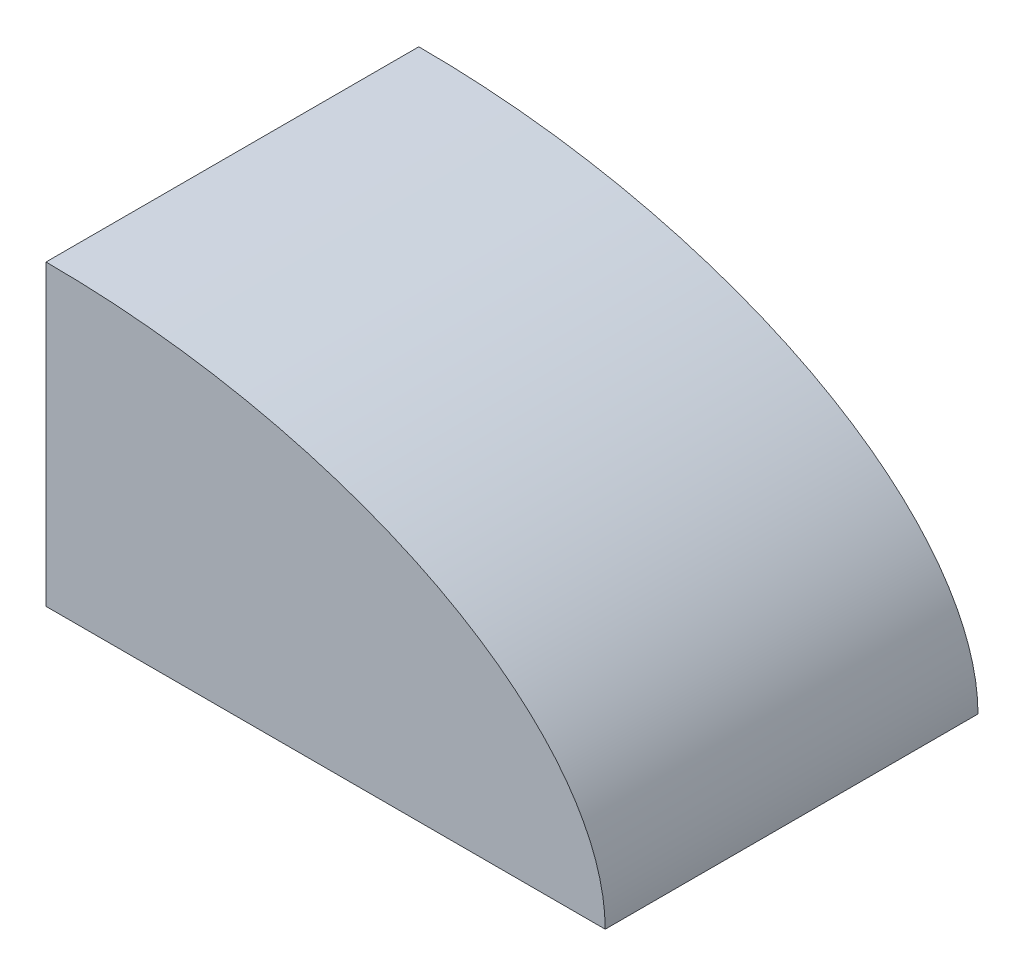
ISO-10303-21;
HEADER;
FILE_DESCRIPTION(('STEP AP214'),'2;1');
FILE_NAME('part.step','',(''),(''),'','','');
FILE_SCHEMA(('AUTOMOTIVE_DESIGN { 1 0 10303 214 1 1 1 1 }'));
ENDSEC;
DATA;
#1=APPLICATION_CONTEXT('core data for automotive mechanical design processes');
#2=APPLICATION_PROTOCOL_DEFINITION('international standard','automotive_design',2000,#1);
#3=PRODUCT_CONTEXT('',#1,'mechanical');
#4=PRODUCT('Part','Part','',(#3));
#5=PRODUCT_RELATED_PRODUCT_CATEGORY('part','',(#4));
#6=PRODUCT_DEFINITION_FORMATION('','',#4);
#7=PRODUCT_DEFINITION_CONTEXT('part definition',#1,'design');
#8=PRODUCT_DEFINITION('design','',#6,#7);
#9=PRODUCT_DEFINITION_SHAPE('','',#8);
#10=(LENGTH_UNIT() NAMED_UNIT(*) SI_UNIT(.MILLI.,.METRE.));
#11=(NAMED_UNIT(*) PLANE_ANGLE_UNIT() SI_UNIT($,.RADIAN.));
#12=(NAMED_UNIT(*) SI_UNIT($,.STERADIAN.) SOLID_ANGLE_UNIT());
#13=UNCERTAINTY_MEASURE_WITH_UNIT(LENGTH_MEASURE(1.E-05),#10,'distance_accuracy_value','');
#14=(GEOMETRIC_REPRESENTATION_CONTEXT(3) GLOBAL_UNCERTAINTY_ASSIGNED_CONTEXT((#13)) GLOBAL_UNIT_ASSIGNED_CONTEXT((#10,
#11,#12)) REPRESENTATION_CONTEXT('',''));
#15=CARTESIAN_POINT('',(0.,0.,0.));
#16=DIRECTION('',(0.,0.,1.));
#17=DIRECTION('',(1.,0.,0.));
#18=AXIS2_PLACEMENT_3D('',#15,#16,#17);
#19=CARTESIAN_POINT('',(10.,10.,10.));
#20=DIRECTION('',(0.,1.,0.));
#21=DIRECTION('',(0.,0.,1.));
#22=AXIS2_PLACEMENT_3D('',#19,#20,#21);
#23=PLANE('',#22);
#24=DIRECTION('',(1.,0.,0.));
#25=VECTOR('',#24,1.);
#26=CARTESIAN_POINT('',(10.,10.,0.));
#27=LINE('',#26,#25);
#28=CARTESIAN_POINT('',(10.,10.,0.));
#29=VERTEX_POINT('',#28);
#30=CARTESIAN_POINT('',(25.,10.,0.));
#31=VERTEX_POINT('',#30);
#32=EDGE_CURVE('E82',#29,#31,#27,.T.);
#33=ORIENTED_EDGE('',*,*,#32,.T.);
#34=DIRECTION('',(0.,0.,-1.));
#35=VECTOR('',#34,1.);
#36=CARTESIAN_POINT('',(25.,10.,10.));
#37=LINE('',#36,#35);
#38=CARTESIAN_POINT('',(25.,10.,10.));
#39=VERTEX_POINT('',#38);
#40=EDGE_CURVE('E11',#39,#31,#37,.T.);
#41=ORIENTED_EDGE('',*,*,#40,.F.);
#42=DIRECTION('',(1.,0.,0.));
#43=VECTOR('',#42,1.);
#44=CARTESIAN_POINT('',(10.,10.,10.));
#45=LINE('',#44,#43);
#46=CARTESIAN_POINT('',(10.,10.,10.));
#47=VERTEX_POINT('',#46);
#48=EDGE_CURVE('E75',#47,#39,#45,.T.);
#49=ORIENTED_EDGE('',*,*,#48,.F.);
#50=DIRECTION('',(0.,0.,-1.));
#51=VECTOR('',#50,1.);
#52=CARTESIAN_POINT('',(10.,10.,10.));
#53=LINE('',#52,#51);
#54=EDGE_CURVE('E83',#47,#29,#53,.T.);
#55=ORIENTED_EDGE('',*,*,#54,.T.);
#56=EDGE_LOOP('',(#33,#41,#49,#55));
#57=FACE_BOUND('',#56,.T.);
#58=ADVANCED_FACE('F35',(#57),#23,.F.);
#59=CARTESIAN_POINT('',(10.,10.,10.));
#60=DIRECTION('',(0.,0.,1.));
#61=DIRECTION('',(1.,0.,0.));
#62=AXIS2_PLACEMENT_3D('',#59,#60,#61);
#63=ELLIPSE('',#62,15.,8.);
#64=DIRECTION('',(0.,0.,-1.));
#65=VECTOR('',#64,1.);
#66=SURFACE_OF_LINEAR_EXTRUSION('',#63,#65);
#67=CARTESIAN_POINT('',(10.,10.,0.));
#68=DIRECTION('',(0.,0.,1.));
#69=DIRECTION('',(1.,0.,0.));
#70=AXIS2_PLACEMENT_3D('',#67,#68,#69);
#71=ELLIPSE('',#70,15.,8.);
#72=CARTESIAN_POINT('',(10.,18.,0.));
#73=VERTEX_POINT('',#72);
#74=EDGE_CURVE('E63',#31,#73,#71,.T.);
#75=ORIENTED_EDGE('',*,*,#74,.T.);
#76=DIRECTION('',(0.,0.,-1.));
#77=VECTOR('',#76,1.);
#78=CARTESIAN_POINT('',(10.,18.,10.));
#79=LINE('',#78,#77);
#80=CARTESIAN_POINT('',(10.,18.,10.));
#81=VERTEX_POINT('',#80);
#82=EDGE_CURVE('E43',#81,#73,#79,.T.);
#83=ORIENTED_EDGE('',*,*,#82,.F.);
#84=EDGE_CURVE('E71',#39,#81,#63,.T.);
#85=ORIENTED_EDGE('',*,*,#84,.F.);
#86=ORIENTED_EDGE('',*,*,#40,.T.);
#87=EDGE_LOOP('',(#75,#83,#85,#86));
#88=FACE_BOUND('',#87,.T.);
#89=ADVANCED_FACE('F72',(#88),#66,.F.);
#90=CARTESIAN_POINT('',(10.,18.,10.));
#91=DIRECTION('',(1.,0.,0.));
#92=DIRECTION('',(0.,0.,-1.));
#93=AXIS2_PLACEMENT_3D('',#90,#91,#92);
#94=PLANE('',#93);
#95=DIRECTION('',(0.,-1.,0.));
#96=VECTOR('',#95,1.);
#97=CARTESIAN_POINT('',(10.,18.,0.));
#98=LINE('',#97,#96);
#99=EDGE_CURVE('E68',#73,#29,#98,.T.);
#100=ORIENTED_EDGE('',*,*,#99,.T.);
#101=ORIENTED_EDGE('',*,*,#54,.F.);
#102=DIRECTION('',(0.,-1.,0.));
#103=VECTOR('',#102,1.);
#104=CARTESIAN_POINT('',(10.,18.,10.));
#105=LINE('',#104,#103);
#106=EDGE_CURVE('E51',#81,#47,#105,.T.);
#107=ORIENTED_EDGE('',*,*,#106,.F.);
#108=ORIENTED_EDGE('',*,*,#82,.T.);
#109=EDGE_LOOP('',(#100,#101,#107,#108));
#110=FACE_BOUND('',#109,.T.);
#111=ADVANCED_FACE('F90',(#110),#94,.F.);
#112=CARTESIAN_POINT('',(10.,10.,10.));
#113=DIRECTION('',(0.,0.,1.));
#114=DIRECTION('',(1.,0.,0.));
#115=AXIS2_PLACEMENT_3D('',#112,#113,#114);
#116=PLANE('',#115);
#117=ORIENTED_EDGE('',*,*,#48,.T.);
#118=ORIENTED_EDGE('',*,*,#84,.T.);
#119=ORIENTED_EDGE('',*,*,#106,.T.);
#120=EDGE_LOOP('',(#117,#118,#119));
#121=FACE_BOUND('',#120,.T.);
#122=ADVANCED_FACE('F78',(#121),#116,.T.);
#123=CARTESIAN_POINT('',(10.,10.,0.));
#124=DIRECTION('',(0.,0.,1.));
#125=DIRECTION('',(1.,0.,0.));
#126=AXIS2_PLACEMENT_3D('',#123,#124,#125);
#127=PLANE('',#126);
#128=ORIENTED_EDGE('',*,*,#32,.F.);
#129=ORIENTED_EDGE('',*,*,#99,.F.);
#130=ORIENTED_EDGE('',*,*,#74,.F.);
#131=EDGE_LOOP('',(#128,#129,#130));
#132=FACE_BOUND('',#131,.T.);
#133=ADVANCED_FACE('F91',(#132),#127,.F.);
#134=CLOSED_SHELL('',(#58,#89,#111,#122,#133));
#135=MANIFOLD_SOLID_BREP('B2',#134);
#136=ADVANCED_BREP_SHAPE_REPRESENTATION('',(#18,#135),#14);
#137=SHAPE_DEFINITION_REPRESENTATION(#9,#136);
ENDSEC;
END-ISO-10303-21;
